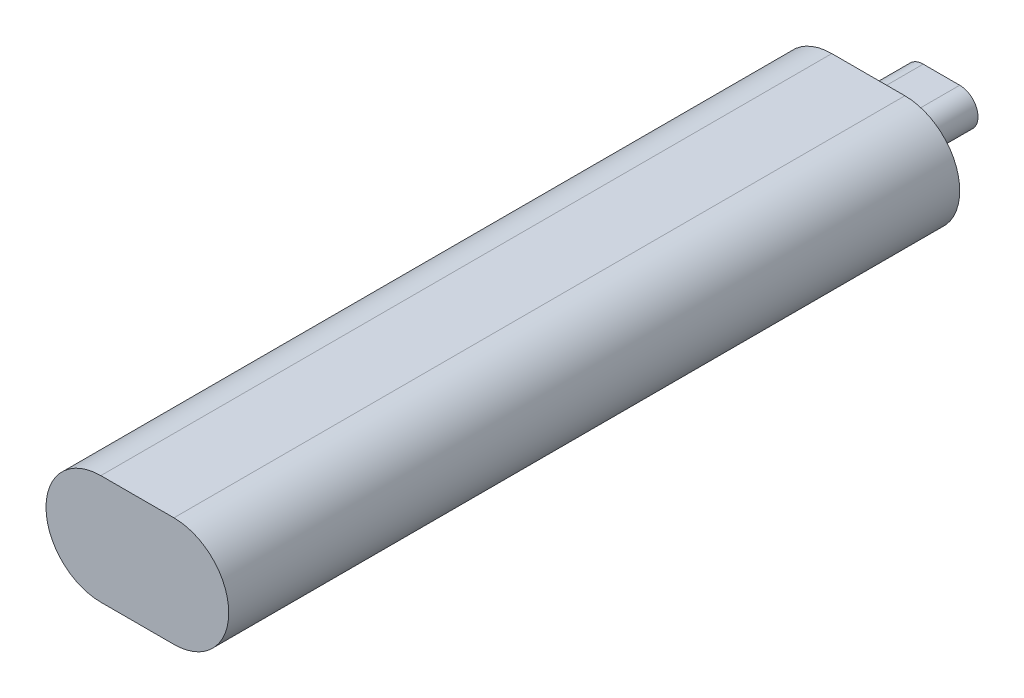
ISO-10303-21;
HEADER;
FILE_DESCRIPTION(('STEP AP214'),'2;1');
FILE_NAME('part.step','',(''),(''),'','','');
FILE_SCHEMA(('AUTOMOTIVE_DESIGN { 1 0 10303 214 1 1 1 1 }'));
ENDSEC;
DATA;
#1=APPLICATION_CONTEXT('core data for automotive mechanical design processes');
#2=APPLICATION_PROTOCOL_DEFINITION('international standard','automotive_design',2000,#1);
#3=PRODUCT_CONTEXT('',#1,'mechanical');
#4=PRODUCT('Part','Part','',(#3));
#5=PRODUCT_RELATED_PRODUCT_CATEGORY('part','',(#4));
#6=PRODUCT_DEFINITION_FORMATION('','',#4);
#7=PRODUCT_DEFINITION_CONTEXT('part definition',#1,'design');
#8=PRODUCT_DEFINITION('design','',#6,#7);
#9=PRODUCT_DEFINITION_SHAPE('','',#8);
#10=(LENGTH_UNIT() NAMED_UNIT(*) SI_UNIT(.MILLI.,.METRE.));
#11=(NAMED_UNIT(*) PLANE_ANGLE_UNIT() SI_UNIT($,.RADIAN.));
#12=(NAMED_UNIT(*) SI_UNIT($,.STERADIAN.) SOLID_ANGLE_UNIT());
#13=UNCERTAINTY_MEASURE_WITH_UNIT(LENGTH_MEASURE(1.E-05),#10,'distance_accuracy_value','');
#14=(GEOMETRIC_REPRESENTATION_CONTEXT(3) GLOBAL_UNCERTAINTY_ASSIGNED_CONTEXT((#13)) GLOBAL_UNIT_ASSIGNED_CONTEXT((#10,
#11,#12)) REPRESENTATION_CONTEXT('',''));
#15=CARTESIAN_POINT('',(0.,0.,0.));
#16=DIRECTION('',(0.,0.,1.));
#17=DIRECTION('',(1.,0.,0.));
#18=AXIS2_PLACEMENT_3D('',#15,#16,#17);
#19=CARTESIAN_POINT('',(-10.,0.,-100.));
#20=DIRECTION('',(0.,0.,1.));
#21=DIRECTION('',(1.,0.,0.));
#22=AXIS2_PLACEMENT_3D('',#19,#20,#21);
#23=PLANE('',#22);
#24=CARTESIAN_POINT('',(-10.,0.,-100.));
#25=DIRECTION('',(0.,0.,1.));
#26=DIRECTION('',(1.,0.,0.));
#27=AXIS2_PLACEMENT_3D('',#24,#25,#26);
#28=CIRCLE('',#27,15.);
#29=CARTESIAN_POINT('',(-10.,15.,-100.));
#30=VERTEX_POINT('',#29);
#31=CARTESIAN_POINT('',(-10.,-15.,-100.));
#32=VERTEX_POINT('',#31);
#33=EDGE_CURVE('E132',#30,#32,#28,.T.);
#34=ORIENTED_EDGE('',*,*,#33,.F.);
#35=DIRECTION('',(-1.,0.,0.));
#36=VECTOR('',#35,1.);
#37=CARTESIAN_POINT('',(-10.,15.,-100.));
#38=LINE('',#37,#36);
#39=CARTESIAN_POINT('',(9.99999999999999,15.,-100.));
#40=VERTEX_POINT('',#39);
#41=EDGE_CURVE('E141',#40,#30,#38,.T.);
#42=ORIENTED_EDGE('',*,*,#41,.F.);
#43=CARTESIAN_POINT('',(10.,0.,-100.));
#44=DIRECTION('',(0.,0.,1.));
#45=DIRECTION('',(1.,0.,0.));
#46=AXIS2_PLACEMENT_3D('',#43,#44,#45);
#47=CIRCLE('',#46,15.);
#48=CARTESIAN_POINT('',(10.,-15.,-100.));
#49=VERTEX_POINT('',#48);
#50=EDGE_CURVE('E152',#49,#40,#47,.T.);
#51=ORIENTED_EDGE('',*,*,#50,.F.);
#52=DIRECTION('',(1.,0.,0.));
#53=VECTOR('',#52,1.);
#54=CARTESIAN_POINT('',(-10.,-15.,-100.));
#55=LINE('',#54,#53);
#56=EDGE_CURVE('E150',#32,#49,#55,.T.);
#57=ORIENTED_EDGE('',*,*,#56,.F.);
#58=EDGE_LOOP('',(#34,#42,#51,#57));
#59=FACE_BOUND('',#58,.T.);
#60=CARTESIAN_POINT('',(5.,0.,-100.));
#61=DIRECTION('',(0.,0.,-1.));
#62=DIRECTION('',(-1.,0.,0.));
#63=AXIS2_PLACEMENT_3D('',#60,#61,#62);
#64=CIRCLE('',#63,5.);
#65=CARTESIAN_POINT('',(5.,5.,-100.));
#66=VERTEX_POINT('',#65);
#67=CARTESIAN_POINT('',(5.,-5.,-100.));
#68=VERTEX_POINT('',#67);
#69=EDGE_CURVE('E120',#66,#68,#64,.T.);
#70=ORIENTED_EDGE('',*,*,#69,.F.);
#71=DIRECTION('',(-1.,0.,0.));
#72=VECTOR('',#71,1.);
#73=CARTESIAN_POINT('',(5.,5.,-100.));
#74=LINE('',#73,#72);
#75=CARTESIAN_POINT('',(-5.,5.,-100.));
#76=VERTEX_POINT('',#75);
#77=EDGE_CURVE('E50',#66,#76,#74,.T.);
#78=ORIENTED_EDGE('',*,*,#77,.T.);
#79=CARTESIAN_POINT('',(-5.,0.,-100.));
#80=DIRECTION('',(0.,0.,-1.));
#81=DIRECTION('',(-1.,0.,0.));
#82=AXIS2_PLACEMENT_3D('',#79,#80,#81);
#83=CIRCLE('',#82,5.);
#84=CARTESIAN_POINT('',(-5.,-5.,-100.));
#85=VERTEX_POINT('',#84);
#86=EDGE_CURVE('E55',#85,#76,#83,.T.);
#87=ORIENTED_EDGE('',*,*,#86,.F.);
#88=DIRECTION('',(-1.,0.,0.));
#89=VECTOR('',#88,1.);
#90=CARTESIAN_POINT('',(5.,-5.,-100.));
#91=LINE('',#90,#89);
#92=EDGE_CURVE('E123',#68,#85,#91,.T.);
#93=ORIENTED_EDGE('',*,*,#92,.F.);
#94=EDGE_LOOP('',(#70,#78,#87,#93));
#95=FACE_BOUND('',#94,.T.);
#96=ADVANCED_FACE('F35',(#59,#95),#23,.F.);
#97=CARTESIAN_POINT('',(-10.,0.,100.));
#98=DIRECTION('',(0.,0.,-1.));
#99=DIRECTION('',(-1.,0.,0.));
#100=AXIS2_PLACEMENT_3D('',#97,#98,#99);
#101=CYLINDRICAL_SURFACE('',#100,15.);
#102=ORIENTED_EDGE('',*,*,#33,.T.);
#103=DIRECTION('',(0.,0.,-1.));
#104=VECTOR('',#103,1.);
#105=CARTESIAN_POINT('',(-10.,-15.,100.));
#106=LINE('',#105,#104);
#107=CARTESIAN_POINT('',(-10.,-15.,100.));
#108=VERTEX_POINT('',#107);
#109=EDGE_CURVE('E11',#108,#32,#106,.T.);
#110=ORIENTED_EDGE('',*,*,#109,.F.);
#111=CARTESIAN_POINT('',(-10.,0.,100.));
#112=DIRECTION('',(0.,0.,1.));
#113=DIRECTION('',(1.,0.,0.));
#114=AXIS2_PLACEMENT_3D('',#111,#112,#113);
#115=CIRCLE('',#114,15.);
#116=CARTESIAN_POINT('',(-10.,15.,100.));
#117=VERTEX_POINT('',#116);
#118=EDGE_CURVE('E137',#117,#108,#115,.T.);
#119=ORIENTED_EDGE('',*,*,#118,.F.);
#120=DIRECTION('',(0.,0.,-1.));
#121=VECTOR('',#120,1.);
#122=CARTESIAN_POINT('',(-10.,15.,100.));
#123=LINE('',#122,#121);
#124=EDGE_CURVE('E147',#117,#30,#123,.T.);
#125=ORIENTED_EDGE('',*,*,#124,.T.);
#126=EDGE_LOOP('',(#102,#110,#119,#125));
#127=FACE_BOUND('',#126,.T.);
#128=ADVANCED_FACE('F37',(#127),#101,.T.);
#129=CARTESIAN_POINT('',(-10.,-15.,100.));
#130=DIRECTION('',(0.,1.,0.));
#131=DIRECTION('',(-1.,0.,0.));
#132=AXIS2_PLACEMENT_3D('',#129,#130,#131);
#133=PLANE('',#132);
#134=ORIENTED_EDGE('',*,*,#56,.T.);
#135=DIRECTION('',(0.,0.,-1.));
#136=VECTOR('',#135,1.);
#137=CARTESIAN_POINT('',(10.,-15.,100.));
#138=LINE('',#137,#136);
#139=CARTESIAN_POINT('',(10.,-15.,100.));
#140=VERTEX_POINT('',#139);
#141=EDGE_CURVE('E43',#140,#49,#138,.T.);
#142=ORIENTED_EDGE('',*,*,#141,.F.);
#143=DIRECTION('',(1.,0.,0.));
#144=VECTOR('',#143,1.);
#145=CARTESIAN_POINT('',(-10.,-15.,100.));
#146=LINE('',#145,#144);
#147=EDGE_CURVE('E140',#108,#140,#146,.T.);
#148=ORIENTED_EDGE('',*,*,#147,.F.);
#149=ORIENTED_EDGE('',*,*,#109,.T.);
#150=EDGE_LOOP('',(#134,#142,#148,#149));
#151=FACE_BOUND('',#150,.T.);
#152=ADVANCED_FACE('F179',(#151),#133,.F.);
#153=CARTESIAN_POINT('',(10.,0.,100.));
#154=DIRECTION('',(0.,0.,-1.));
#155=DIRECTION('',(-1.,0.,0.));
#156=AXIS2_PLACEMENT_3D('',#153,#154,#155);
#157=CYLINDRICAL_SURFACE('',#156,15.);
#158=ORIENTED_EDGE('',*,*,#50,.T.);
#159=DIRECTION('',(0.,0.,-1.));
#160=VECTOR('',#159,1.);
#161=CARTESIAN_POINT('',(9.99999999999999,15.,100.));
#162=LINE('',#161,#160);
#163=CARTESIAN_POINT('',(9.99999999999999,15.,100.));
#164=VERTEX_POINT('',#163);
#165=EDGE_CURVE('E157',#164,#40,#162,.T.);
#166=ORIENTED_EDGE('',*,*,#165,.F.);
#167=CARTESIAN_POINT('',(10.,0.,100.));
#168=DIRECTION('',(0.,0.,1.));
#169=DIRECTION('',(1.,0.,0.));
#170=AXIS2_PLACEMENT_3D('',#167,#168,#169);
#171=CIRCLE('',#170,15.);
#172=EDGE_CURVE('E143',#140,#164,#171,.T.);
#173=ORIENTED_EDGE('',*,*,#172,.F.);
#174=ORIENTED_EDGE('',*,*,#141,.T.);
#175=EDGE_LOOP('',(#158,#166,#173,#174));
#176=FACE_BOUND('',#175,.T.);
#177=ADVANCED_FACE('F164',(#176),#157,.T.);
#178=CARTESIAN_POINT('',(-10.,15.,100.));
#179=DIRECTION('',(0.,-1.,0.));
#180=DIRECTION('',(1.,0.,0.));
#181=AXIS2_PLACEMENT_3D('',#178,#179,#180);
#182=PLANE('',#181);
#183=ORIENTED_EDGE('',*,*,#41,.T.);
#184=ORIENTED_EDGE('',*,*,#124,.F.);
#185=DIRECTION('',(-1.,0.,0.));
#186=VECTOR('',#185,1.);
#187=CARTESIAN_POINT('',(-10.,15.,100.));
#188=LINE('',#187,#186);
#189=EDGE_CURVE('E145',#164,#117,#188,.T.);
#190=ORIENTED_EDGE('',*,*,#189,.F.);
#191=ORIENTED_EDGE('',*,*,#165,.T.);
#192=EDGE_LOOP('',(#183,#184,#190,#191));
#193=FACE_BOUND('',#192,.T.);
#194=ADVANCED_FACE('F172',(#193),#182,.F.);
#195=CARTESIAN_POINT('',(-10.,0.,100.));
#196=DIRECTION('',(0.,0.,1.));
#197=DIRECTION('',(1.,0.,0.));
#198=AXIS2_PLACEMENT_3D('',#195,#196,#197);
#199=PLANE('',#198);
#200=ORIENTED_EDGE('',*,*,#118,.T.);
#201=ORIENTED_EDGE('',*,*,#147,.T.);
#202=ORIENTED_EDGE('',*,*,#172,.T.);
#203=ORIENTED_EDGE('',*,*,#189,.T.);
#204=EDGE_LOOP('',(#200,#201,#202,#203));
#205=FACE_BOUND('',#204,.T.);
#206=ADVANCED_FACE('F178',(#205),#199,.T.);
#207=CARTESIAN_POINT('',(5.,5.,-120.));
#208=DIRECTION('',(0.,1.,0.));
#209=DIRECTION('',(-1.,0.,0.));
#210=AXIS2_PLACEMENT_3D('',#207,#208,#209);
#211=PLANE('',#210);
#212=ORIENTED_EDGE('',*,*,#77,.F.);
#213=DIRECTION('',(0.,0.,1.));
#214=VECTOR('',#213,1.);
#215=CARTESIAN_POINT('',(5.,5.,-120.));
#216=LINE('',#215,#214);
#217=CARTESIAN_POINT('',(5.,5.,-120.));
#218=VERTEX_POINT('',#217);
#219=EDGE_CURVE('E118',#218,#66,#216,.T.);
#220=ORIENTED_EDGE('',*,*,#219,.F.);
#221=DIRECTION('',(-1.,0.,0.));
#222=VECTOR('',#221,1.);
#223=CARTESIAN_POINT('',(5.,5.,-120.));
#224=LINE('',#223,#222);
#225=CARTESIAN_POINT('',(-5.,5.,-120.));
#226=VERTEX_POINT('',#225);
#227=EDGE_CURVE('E103',#218,#226,#224,.T.);
#228=ORIENTED_EDGE('',*,*,#227,.T.);
#229=DIRECTION('',(0.,0.,1.));
#230=VECTOR('',#229,1.);
#231=CARTESIAN_POINT('',(-5.,5.,-120.));
#232=LINE('',#231,#230);
#233=EDGE_CURVE('E110',#226,#76,#232,.T.);
#234=ORIENTED_EDGE('',*,*,#233,.T.);
#235=EDGE_LOOP('',(#212,#220,#228,#234));
#236=FACE_BOUND('',#235,.T.);
#237=ADVANCED_FACE('F116',(#236),#211,.T.);
#238=CARTESIAN_POINT('',(5.,0.,-120.));
#239=DIRECTION('',(0.,0.,1.));
#240=DIRECTION('',(1.,0.,0.));
#241=AXIS2_PLACEMENT_3D('',#238,#239,#240);
#242=CYLINDRICAL_SURFACE('',#241,5.);
#243=ORIENTED_EDGE('',*,*,#69,.T.);
#244=DIRECTION('',(0.,0.,1.));
#245=VECTOR('',#244,1.);
#246=CARTESIAN_POINT('',(5.,-5.,-120.));
#247=LINE('',#246,#245);
#248=CARTESIAN_POINT('',(5.,-5.,-120.));
#249=VERTEX_POINT('',#248);
#250=EDGE_CURVE('E133',#249,#68,#247,.T.);
#251=ORIENTED_EDGE('',*,*,#250,.F.);
#252=CARTESIAN_POINT('',(5.,0.,-120.));
#253=DIRECTION('',(0.,0.,-1.));
#254=DIRECTION('',(-1.,0.,0.));
#255=AXIS2_PLACEMENT_3D('',#252,#253,#254);
#256=CIRCLE('',#255,5.);
#257=EDGE_CURVE('E114',#218,#249,#256,.T.);
#258=ORIENTED_EDGE('',*,*,#257,.F.);
#259=ORIENTED_EDGE('',*,*,#219,.T.);
#260=EDGE_LOOP('',(#243,#251,#258,#259));
#261=FACE_BOUND('',#260,.T.);
#262=ADVANCED_FACE('F200',(#261),#242,.T.);
#263=CARTESIAN_POINT('',(5.,-5.,-120.));
#264=DIRECTION('',(0.,1.,0.));
#265=DIRECTION('',(-1.,0.,0.));
#266=AXIS2_PLACEMENT_3D('',#263,#264,#265);
#267=PLANE('',#266);
#268=ORIENTED_EDGE('',*,*,#92,.T.);
#269=DIRECTION('',(0.,0.,1.));
#270=VECTOR('',#269,1.);
#271=CARTESIAN_POINT('',(-5.,-5.,-120.));
#272=LINE('',#271,#270);
#273=CARTESIAN_POINT('',(-5.,-5.,-120.));
#274=VERTEX_POINT('',#273);
#275=EDGE_CURVE('E113',#274,#85,#272,.T.);
#276=ORIENTED_EDGE('',*,*,#275,.F.);
#277=DIRECTION('',(-1.,0.,0.));
#278=VECTOR('',#277,1.);
#279=CARTESIAN_POINT('',(5.,-5.,-120.));
#280=LINE('',#279,#278);
#281=EDGE_CURVE('E105',#249,#274,#280,.T.);
#282=ORIENTED_EDGE('',*,*,#281,.F.);
#283=ORIENTED_EDGE('',*,*,#250,.T.);
#284=EDGE_LOOP('',(#268,#276,#282,#283));
#285=FACE_BOUND('',#284,.T.);
#286=ADVANCED_FACE('F204',(#285),#267,.F.);
#287=CARTESIAN_POINT('',(-5.,0.,-120.));
#288=DIRECTION('',(0.,0.,1.));
#289=DIRECTION('',(1.,0.,0.));
#290=AXIS2_PLACEMENT_3D('',#287,#288,#289);
#291=CYLINDRICAL_SURFACE('',#290,5.);
#292=ORIENTED_EDGE('',*,*,#86,.T.);
#293=ORIENTED_EDGE('',*,*,#233,.F.);
#294=CARTESIAN_POINT('',(-5.,0.,-120.));
#295=DIRECTION('',(0.,0.,-1.));
#296=DIRECTION('',(-1.,0.,0.));
#297=AXIS2_PLACEMENT_3D('',#294,#295,#296);
#298=CIRCLE('',#297,5.);
#299=EDGE_CURVE('E99',#274,#226,#298,.T.);
#300=ORIENTED_EDGE('',*,*,#299,.F.);
#301=ORIENTED_EDGE('',*,*,#275,.T.);
#302=EDGE_LOOP('',(#292,#293,#300,#301));
#303=FACE_BOUND('',#302,.T.);
#304=ADVANCED_FACE('F111',(#303),#291,.T.);
#305=CARTESIAN_POINT('',(-5.,0.,-120.));
#306=DIRECTION('',(0.,0.,-1.));
#307=DIRECTION('',(-1.,0.,0.));
#308=AXIS2_PLACEMENT_3D('',#305,#306,#307);
#309=PLANE('',#308);
#310=ORIENTED_EDGE('',*,*,#227,.F.);
#311=ORIENTED_EDGE('',*,*,#257,.T.);
#312=ORIENTED_EDGE('',*,*,#281,.T.);
#313=ORIENTED_EDGE('',*,*,#299,.T.);
#314=EDGE_LOOP('',(#310,#311,#312,#313));
#315=FACE_BOUND('',#314,.T.);
#316=ADVANCED_FACE('F101',(#315),#309,.T.);
#317=CLOSED_SHELL('',(#96,#128,#152,#177,#194,#206,#237,#262,#286,#304,#316));
#318=MANIFOLD_SOLID_BREP('B2',#317);
#319=ADVANCED_BREP_SHAPE_REPRESENTATION('',(#18,#318),#14);
#320=SHAPE_DEFINITION_REPRESENTATION(#9,#319);
ENDSEC;
END-ISO-10303-21;
